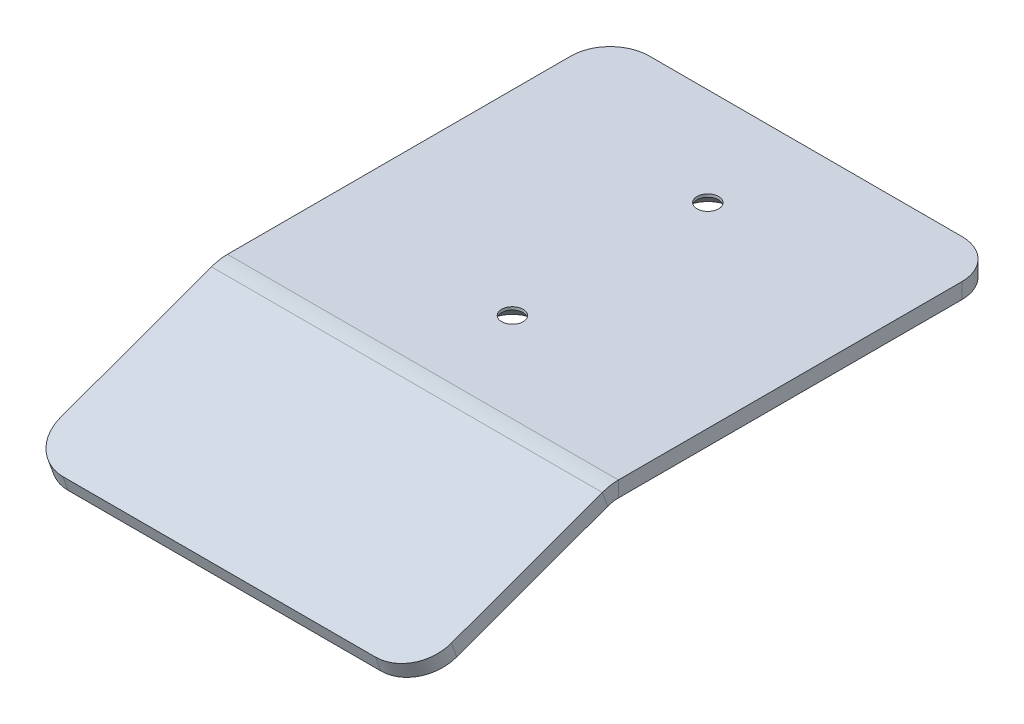
ISO-10303-21;
HEADER;
FILE_DESCRIPTION(('STEP AP214'),'2;1');
FILE_NAME('part.step','',(''),(''),'','','');
FILE_SCHEMA(('AUTOMOTIVE_DESIGN { 1 0 10303 214 1 1 1 1 }'));
ENDSEC;
DATA;
#1=APPLICATION_CONTEXT('core data for automotive mechanical design processes');
#2=APPLICATION_PROTOCOL_DEFINITION('international standard','automotive_design',2000,#1);
#3=PRODUCT_CONTEXT('',#1,'mechanical');
#4=PRODUCT('Part','Part','',(#3));
#5=PRODUCT_RELATED_PRODUCT_CATEGORY('part','',(#4));
#6=PRODUCT_DEFINITION_FORMATION('','',#4);
#7=PRODUCT_DEFINITION_CONTEXT('part definition',#1,'design');
#8=PRODUCT_DEFINITION('design','',#6,#7);
#9=PRODUCT_DEFINITION_SHAPE('','',#8);
#10=(LENGTH_UNIT() NAMED_UNIT(*) SI_UNIT(.MILLI.,.METRE.));
#11=(NAMED_UNIT(*) PLANE_ANGLE_UNIT() SI_UNIT($,.RADIAN.));
#12=(NAMED_UNIT(*) SI_UNIT($,.STERADIAN.) SOLID_ANGLE_UNIT());
#13=UNCERTAINTY_MEASURE_WITH_UNIT(LENGTH_MEASURE(1.E-05),#10,'distance_accuracy_value','');
#14=(GEOMETRIC_REPRESENTATION_CONTEXT(3) GLOBAL_UNCERTAINTY_ASSIGNED_CONTEXT((#13)) GLOBAL_UNIT_ASSIGNED_CONTEXT((#10,
#11,#12)) REPRESENTATION_CONTEXT('',''));
#15=CARTESIAN_POINT('',(0.,0.,0.));
#16=DIRECTION('',(0.,0.,1.));
#17=DIRECTION('',(1.,0.,0.));
#18=AXIS2_PLACEMENT_3D('',#15,#16,#17);
#19=CARTESIAN_POINT('',(50.,0.,47.8840762314985));
#20=DIRECTION('',(1.,0.,0.));
#21=DIRECTION('',(0.,0.,-1.));
#22=AXIS2_PLACEMENT_3D('',#19,#20,#21);
#23=PLANE('',#22);
#24=DIRECTION('',(0.,-1.,0.));
#25=VECTOR('',#24,1.);
#26=CARTESIAN_POINT('',(50.,0.,47.8840762314985));
#27=LINE('',#26,#25);
#28=CARTESIAN_POINT('',(50.,0.,47.8840762314985));
#29=VERTEX_POINT('',#28);
#30=CARTESIAN_POINT('',(50.,-4.,47.8840762314985));
#31=VERTEX_POINT('',#30);
#32=EDGE_CURVE('E129',#29,#31,#27,.T.);
#33=ORIENTED_EDGE('',*,*,#32,.F.);
#34=CARTESIAN_POINT('',(50.,-12.,47.8840762314985));
#35=DIRECTION('',(-1.,0.,0.));
#36=DIRECTION('',(0.,0.,1.));
#37=AXIS2_PLACEMENT_3D('',#34,#35,#36);
#38=CIRCLE('',#37,12.);
#39=CARTESIAN_POINT('',(50.,-0.723688550569075,51.9883179514064));
#40=VERTEX_POINT('',#39);
#41=EDGE_CURVE('E133',#40,#29,#38,.T.);
#42=ORIENTED_EDGE('',*,*,#41,.F.);
#43=DIRECTION('',(0.,0.93969262078591,0.342020143325664));
#44=VECTOR('',#43,1.);
#45=CARTESIAN_POINT('',(50.,-4.48245903371272,50.6202373781038));
#46=LINE('',#45,#44);
#47=CARTESIAN_POINT('',(50.,-4.48245903371272,50.6202373781038));
#48=VERTEX_POINT('',#47);
#49=EDGE_CURVE('E141',#48,#40,#46,.T.);
#50=ORIENTED_EDGE('',*,*,#49,.F.);
#51=CARTESIAN_POINT('',(50.,-12.,47.8840762314985));
#52=DIRECTION('',(1.,0.,0.));
#53=DIRECTION('',(0.,0.,-1.));
#54=AXIS2_PLACEMENT_3D('',#51,#52,#53);
#55=CIRCLE('',#54,8.);
#56=EDGE_CURVE('E135',#48,#31,#55,.F.);
#57=ORIENTED_EDGE('',*,*,#56,.T.);
#58=EDGE_LOOP('',(#33,#42,#50,#57));
#59=FACE_BOUND('',#58,.T.);
#60=ADVANCED_FACE('F39',(#59),#23,.T.);
#61=CARTESIAN_POINT('',(50.,-4.48245903371272,50.6202373781038));
#62=DIRECTION('',(1.,0.,0.));
#63=DIRECTION('',(0.,0.,-1.));
#64=AXIS2_PLACEMENT_3D('',#61,#62,#63);
#65=PLANE('',#64);
#66=DIRECTION('',(0.,0.,-1.));
#67=VECTOR('',#66,1.);
#68=CARTESIAN_POINT('',(50.,-4.,50.));
#69=LINE('',#68,#67);
#70=CARTESIAN_POINT('',(50.,-3.99999999999998,-40.));
#71=VERTEX_POINT('',#70);
#72=EDGE_CURVE('E163',#31,#71,#69,.T.);
#73=ORIENTED_EDGE('',*,*,#72,.T.);
#74=DIRECTION('',(0.,-1.,0.));
#75=VECTOR('',#74,1.);
#76=CARTESIAN_POINT('',(50.,-4.48245903371272,-40.));
#77=LINE('',#76,#75);
#78=CARTESIAN_POINT('',(50.,0.,-40.));
#79=VERTEX_POINT('',#78);
#80=EDGE_CURVE('E162',#71,#79,#77,.F.);
#81=ORIENTED_EDGE('',*,*,#80,.T.);
#82=DIRECTION('',(0.,0.,-1.));
#83=VECTOR('',#82,1.);
#84=CARTESIAN_POINT('',(50.,0.,50.));
#85=LINE('',#84,#83);
#86=EDGE_CURVE('E150',#29,#79,#85,.T.);
#87=ORIENTED_EDGE('',*,*,#86,.F.);
#88=ORIENTED_EDGE('',*,*,#32,.T.);
#89=EDGE_LOOP('',(#73,#81,#87,#88));
#90=FACE_BOUND('',#89,.T.);
#91=ADVANCED_FACE('F160',(#90),#65,.T.);
#92=CARTESIAN_POINT('',(-50.,-0.723688550569075,51.9883179514064));
#93=DIRECTION('',(-1.,0.,0.));
#94=DIRECTION('',(0.,0.,1.));
#95=AXIS2_PLACEMENT_3D('',#92,#93,#94);
#96=PLANE('',#95);
#97=DIRECTION('',(0.,-0.93969262078591,-0.342020143325664));
#98=VECTOR('',#97,1.);
#99=CARTESIAN_POINT('',(-50.,-0.723688550569075,51.9883179514064));
#100=LINE('',#99,#98);
#101=CARTESIAN_POINT('',(-50.,-0.723688550569075,51.9883179514064));
#102=VERTEX_POINT('',#101);
#103=CARTESIAN_POINT('',(-50.,-4.48245903371272,50.6202373781038));
#104=VERTEX_POINT('',#103);
#105=EDGE_CURVE('E207',#102,#104,#100,.T.);
#106=ORIENTED_EDGE('',*,*,#105,.F.);
#107=CARTESIAN_POINT('',(-50.,-12.,47.8840762314985));
#108=DIRECTION('',(-1.,0.,0.));
#109=DIRECTION('',(0.,0.,1.));
#110=AXIS2_PLACEMENT_3D('',#107,#108,#109);
#111=CIRCLE('',#110,12.);
#112=CARTESIAN_POINT('',(-50.,0.,47.8840762314985));
#113=VERTEX_POINT('',#112);
#114=EDGE_CURVE('E182',#102,#113,#111,.T.);
#115=ORIENTED_EDGE('',*,*,#114,.T.);
#116=DIRECTION('',(0.,1.,0.));
#117=VECTOR('',#116,1.);
#118=CARTESIAN_POINT('',(-50.,-4.,47.8840762314985));
#119=LINE('',#118,#117);
#120=CARTESIAN_POINT('',(-50.,-4.,47.8840762314985));
#121=VERTEX_POINT('',#120);
#122=EDGE_CURVE('E205',#121,#113,#119,.T.);
#123=ORIENTED_EDGE('',*,*,#122,.F.);
#124=CARTESIAN_POINT('',(-50.,-12.,47.8840762314985));
#125=DIRECTION('',(1.,0.,0.));
#126=DIRECTION('',(0.,0.,-1.));
#127=AXIS2_PLACEMENT_3D('',#124,#125,#126);
#128=CIRCLE('',#127,8.);
#129=EDGE_CURVE('E188',#104,#121,#128,.F.);
#130=ORIENTED_EDGE('',*,*,#129,.F.);
#131=EDGE_LOOP('',(#106,#115,#123,#130));
#132=FACE_BOUND('',#131,.T.);
#133=ADVANCED_FACE('F316',(#132),#96,.T.);
#134=CARTESIAN_POINT('',(-50.,-4.,47.8840762314985));
#135=DIRECTION('',(-1.,0.,0.));
#136=DIRECTION('',(0.,0.,1.));
#137=AXIS2_PLACEMENT_3D('',#134,#135,#136);
#138=PLANE('',#137);
#139=DIRECTION('',(0.,0.342020143325663,-0.93969262078591));
#140=VECTOR('',#139,1.);
#141=CARTESIAN_POINT('',(-50.,-3.75877048314364,48.6319194266973));
#142=LINE('',#141,#140);
#143=CARTESIAN_POINT('',(-50.,-18.5370807631968,89.2349932188382));
#144=VERTEX_POINT('',#143);
#145=EDGE_CURVE('E186',#144,#104,#142,.T.);
#146=ORIENTED_EDGE('',*,*,#145,.F.);
#147=DIRECTION('',(0.,0.939692620785911,0.342020143325662));
#148=VECTOR('',#147,1.);
#149=CARTESIAN_POINT('',(-50.,-18.9904439570081,89.0699825109791));
#150=LINE('',#149,#148);
#151=CARTESIAN_POINT('',(-50.,-14.7783102800531,90.6030737921409));
#152=VERTEX_POINT('',#151);
#153=EDGE_CURVE('E228',#144,#152,#150,.T.);
#154=ORIENTED_EDGE('',*,*,#153,.T.);
#155=DIRECTION('',(0.,0.342020143325663,-0.93969262078591));
#156=VECTOR('',#155,1.);
#157=CARTESIAN_POINT('',(-50.,0.,50.));
#158=LINE('',#157,#156);
#159=EDGE_CURVE('E184',#152,#102,#158,.T.);
#160=ORIENTED_EDGE('',*,*,#159,.T.);
#161=ORIENTED_EDGE('',*,*,#105,.T.);
#162=EDGE_LOOP('',(#146,#154,#160,#161));
#163=FACE_BOUND('',#162,.T.);
#164=ADVANCED_FACE('F248',(#163),#138,.T.);
#165=CARTESIAN_POINT('',(50.,-4.,50.));
#166=DIRECTION('',(0.,1.,0.));
#167=DIRECTION('',(0.,0.,1.));
#168=AXIS2_PLACEMENT_3D('',#165,#166,#167);
#169=PLANE('',#168);
#170=CARTESIAN_POINT('',(0.,-3.99999999999999,25.));
#171=DIRECTION('',(0.,-1.,0.));
#172=DIRECTION('',(0.,0.,-1.));
#173=AXIS2_PLACEMENT_3D('',#170,#171,#172);
#174=CIRCLE('',#173,6.);
#175=CARTESIAN_POINT('',(0.,-3.99999999999999,19.));
#176=VERTEX_POINT('',#175);
#177=EDGE_CURVE('E283',#176,#176,#174,.T.);
#178=ORIENTED_EDGE('',*,*,#177,.F.);
#179=EDGE_LOOP('',(#178));
#180=FACE_BOUND('',#179,.T.);
#181=CARTESIAN_POINT('',(0.,-3.99999999999999,-25.));
#182=DIRECTION('',(0.,-1.,0.));
#183=DIRECTION('',(0.,0.,-1.));
#184=AXIS2_PLACEMENT_3D('',#181,#182,#183);
#185=CIRCLE('',#184,6.);
#186=CARTESIAN_POINT('',(0.,-3.99999999999999,-31.));
#187=VERTEX_POINT('',#186);
#188=EDGE_CURVE('E274',#187,#187,#185,.T.);
#189=ORIENTED_EDGE('',*,*,#188,.F.);
#190=EDGE_LOOP('',(#189));
#191=FACE_BOUND('',#190,.T.);
#192=DIRECTION('',(0.,0.,-1.));
#193=VECTOR('',#192,1.);
#194=CARTESIAN_POINT('',(-50.,-4.,50.));
#195=LINE('',#194,#193);
#196=CARTESIAN_POINT('',(-50.,-3.99999999999998,-40.));
#197=VERTEX_POINT('',#196);
#198=EDGE_CURVE('E177',#121,#197,#195,.T.);
#199=ORIENTED_EDGE('',*,*,#198,.T.);
#200=CARTESIAN_POINT('',(-40.,-3.99999999999998,-40.));
#201=DIRECTION('',(0.,1.,0.));
#202=DIRECTION('',(0.,0.,1.));
#203=AXIS2_PLACEMENT_3D('',#200,#201,#202);
#204=CIRCLE('',#203,10.);
#205=CARTESIAN_POINT('',(-40.,-3.99999999999998,-50.));
#206=VERTEX_POINT('',#205);
#207=EDGE_CURVE('E216',#197,#206,#204,.F.);
#208=ORIENTED_EDGE('',*,*,#207,.T.);
#209=DIRECTION('',(-1.,0.,0.));
#210=VECTOR('',#209,1.);
#211=CARTESIAN_POINT('',(50.,-3.99999999999998,-50.));
#212=LINE('',#211,#210);
#213=CARTESIAN_POINT('',(40.,-3.99999999999998,-50.));
#214=VERTEX_POINT('',#213);
#215=EDGE_CURVE('E202',#214,#206,#212,.T.);
#216=ORIENTED_EDGE('',*,*,#215,.F.);
#217=CARTESIAN_POINT('',(40.,-3.99999999999998,-40.));
#218=DIRECTION('',(0.,1.,0.));
#219=DIRECTION('',(0.,0.,1.));
#220=AXIS2_PLACEMENT_3D('',#217,#218,#219);
#221=CIRCLE('',#220,10.);
#222=EDGE_CURVE('E214',#214,#71,#221,.F.);
#223=ORIENTED_EDGE('',*,*,#222,.T.);
#224=ORIENTED_EDGE('',*,*,#72,.F.);
#225=DIRECTION('',(-1.,0.,0.));
#226=VECTOR('',#225,1.);
#227=CARTESIAN_POINT('',(50.,-4.,47.8840762314985));
#228=LINE('',#227,#226);
#229=EDGE_CURVE('E176',#31,#121,#228,.T.);
#230=ORIENTED_EDGE('',*,*,#229,.T.);
#231=EDGE_LOOP('',(#199,#208,#216,#223,#224,#230));
#232=FACE_BOUND('',#231,.T.);
#233=ADVANCED_FACE('F266',(#180,#191,#232),#169,.F.);
#234=CARTESIAN_POINT('',(50.,0.,-50.));
#235=DIRECTION('',(0.,0.,-1.));
#236=DIRECTION('',(-1.,0.,0.));
#237=AXIS2_PLACEMENT_3D('',#234,#235,#236);
#238=PLANE('',#237);
#239=ORIENTED_EDGE('',*,*,#215,.T.);
#240=DIRECTION('',(0.,-1.,0.));
#241=VECTOR('',#240,1.);
#242=CARTESIAN_POINT('',(-40.,0.,-50.));
#243=LINE('',#242,#241);
#244=CARTESIAN_POINT('',(-40.,0.,-50.));
#245=VERTEX_POINT('',#244);
#246=EDGE_CURVE('E221',#206,#245,#243,.F.);
#247=ORIENTED_EDGE('',*,*,#246,.T.);
#248=DIRECTION('',(-1.,0.,0.));
#249=VECTOR('',#248,1.);
#250=CARTESIAN_POINT('',(50.,0.,-50.));
#251=LINE('',#250,#249);
#252=CARTESIAN_POINT('',(40.,0.,-50.));
#253=VERTEX_POINT('',#252);
#254=EDGE_CURVE('E157',#253,#245,#251,.T.);
#255=ORIENTED_EDGE('',*,*,#254,.F.);
#256=DIRECTION('',(0.,-1.,0.));
#257=VECTOR('',#256,1.);
#258=CARTESIAN_POINT('',(40.,0.,-50.));
#259=LINE('',#258,#257);
#260=EDGE_CURVE('E218',#253,#214,#259,.T.);
#261=ORIENTED_EDGE('',*,*,#260,.T.);
#262=EDGE_LOOP('',(#239,#247,#255,#261));
#263=FACE_BOUND('',#262,.T.);
#264=ADVANCED_FACE('F291',(#263),#238,.T.);
#265=CARTESIAN_POINT('',(50.,0.,50.));
#266=DIRECTION('',(0.,1.,0.));
#267=DIRECTION('',(0.,0.,1.));
#268=AXIS2_PLACEMENT_3D('',#265,#266,#267);
#269=PLANE('',#268);
#270=CARTESIAN_POINT('',(0.,0.,25.));
#271=DIRECTION('',(0.,-1.,0.));
#272=DIRECTION('',(0.,0.,-1.));
#273=AXIS2_PLACEMENT_3D('',#270,#271,#272);
#274=CIRCLE('',#273,2.75);
#275=CARTESIAN_POINT('',(0.,0.,22.25));
#276=VERTEX_POINT('',#275);
#277=EDGE_CURVE('E277',#276,#276,#274,.T.);
#278=ORIENTED_EDGE('',*,*,#277,.T.);
#279=EDGE_LOOP('',(#278));
#280=FACE_BOUND('',#279,.T.);
#281=CARTESIAN_POINT('',(0.,0.,-25.));
#282=DIRECTION('',(0.,-1.,0.));
#283=DIRECTION('',(0.,0.,-1.));
#284=AXIS2_PLACEMENT_3D('',#281,#282,#283);
#285=CIRCLE('',#284,2.75);
#286=CARTESIAN_POINT('',(0.,0.,-27.75));
#287=VERTEX_POINT('',#286);
#288=EDGE_CURVE('E180',#287,#287,#285,.T.);
#289=ORIENTED_EDGE('',*,*,#288,.T.);
#290=EDGE_LOOP('',(#289));
#291=FACE_BOUND('',#290,.T.);
#292=ORIENTED_EDGE('',*,*,#254,.T.);
#293=CARTESIAN_POINT('',(-40.,0.,-40.));
#294=DIRECTION('',(0.,1.,0.));
#295=DIRECTION('',(0.,0.,1.));
#296=AXIS2_PLACEMENT_3D('',#293,#294,#295);
#297=CIRCLE('',#296,10.);
#298=CARTESIAN_POINT('',(-50.,0.,-40.));
#299=VERTEX_POINT('',#298);
#300=EDGE_CURVE('E225',#245,#299,#297,.T.);
#301=ORIENTED_EDGE('',*,*,#300,.T.);
#302=DIRECTION('',(0.,0.,-1.));
#303=VECTOR('',#302,1.);
#304=CARTESIAN_POINT('',(-50.,0.,50.));
#305=LINE('',#304,#303);
#306=EDGE_CURVE('E153',#113,#299,#305,.T.);
#307=ORIENTED_EDGE('',*,*,#306,.F.);
#308=DIRECTION('',(-1.,0.,0.));
#309=VECTOR('',#308,1.);
#310=CARTESIAN_POINT('',(50.,0.,47.8840762314985));
#311=LINE('',#310,#309);
#312=EDGE_CURVE('E147',#29,#113,#311,.T.);
#313=ORIENTED_EDGE('',*,*,#312,.F.);
#314=ORIENTED_EDGE('',*,*,#86,.T.);
#315=CARTESIAN_POINT('',(40.,0.,-40.));
#316=DIRECTION('',(0.,1.,0.));
#317=DIRECTION('',(0.,0.,1.));
#318=AXIS2_PLACEMENT_3D('',#315,#316,#317);
#319=CIRCLE('',#318,10.);
#320=EDGE_CURVE('E223',#79,#253,#319,.T.);
#321=ORIENTED_EDGE('',*,*,#320,.T.);
#322=EDGE_LOOP('',(#292,#301,#307,#313,#314,#321));
#323=FACE_BOUND('',#322,.T.);
#324=ADVANCED_FACE('F149',(#280,#291,#323),#269,.T.);
#325=CARTESIAN_POINT('',(50.,-12.,47.8840762314985));
#326=DIRECTION('',(-1.,0.,0.));
#327=DIRECTION('',(0.,0.,1.));
#328=AXIS2_PLACEMENT_3D('',#325,#326,#327);
#329=CYLINDRICAL_SURFACE('',#328,12.);
#330=ORIENTED_EDGE('',*,*,#114,.F.);
#331=DIRECTION('',(-1.,0.,0.));
#332=VECTOR('',#331,1.);
#333=CARTESIAN_POINT('',(50.,-0.723688550569075,51.9883179514064));
#334=LINE('',#333,#332);
#335=EDGE_CURVE('E158',#40,#102,#334,.T.);
#336=ORIENTED_EDGE('',*,*,#335,.F.);
#337=ORIENTED_EDGE('',*,*,#41,.T.);
#338=ORIENTED_EDGE('',*,*,#312,.T.);
#339=EDGE_LOOP('',(#330,#336,#337,#338));
#340=FACE_BOUND('',#339,.T.);
#341=ADVANCED_FACE('F166',(#340),#329,.T.);
#342=CARTESIAN_POINT('',(50.,0.,50.));
#343=DIRECTION('',(0.,0.93969262078591,0.342020143325663));
#344=DIRECTION('',(0.,-0.342020143325663,0.93969262078591));
#345=AXIS2_PLACEMENT_3D('',#342,#343,#344);
#346=PLANE('',#345);
#347=ORIENTED_EDGE('',*,*,#159,.F.);
#348=CARTESIAN_POINT('',(-40.,-14.7783102800531,90.6030737921409));
#349=DIRECTION('',(0.,0.93969262078591,0.342020143325663));
#350=DIRECTION('',(0.,-0.342020143325663,0.93969262078591));
#351=AXIS2_PLACEMENT_3D('',#348,#349,#350);
#352=CIRCLE('',#351,10.);
#353=CARTESIAN_POINT('',(-40.,-18.1985117133098,100.));
#354=VERTEX_POINT('',#353);
#355=EDGE_CURVE('E233',#152,#354,#352,.T.);
#356=ORIENTED_EDGE('',*,*,#355,.T.);
#357=DIRECTION('',(-1.,0.,0.));
#358=VECTOR('',#357,1.);
#359=CARTESIAN_POINT('',(50.,-18.1985117133098,100.));
#360=LINE('',#359,#358);
#361=CARTESIAN_POINT('',(40.,-18.1985117133098,100.));
#362=VERTEX_POINT('',#361);
#363=EDGE_CURVE('E198',#362,#354,#360,.T.);
#364=ORIENTED_EDGE('',*,*,#363,.F.);
#365=CARTESIAN_POINT('',(40.,-14.7783102800531,90.6030737921409));
#366=DIRECTION('',(0.,0.93969262078591,0.342020143325663));
#367=DIRECTION('',(0.,-0.342020143325663,0.93969262078591));
#368=AXIS2_PLACEMENT_3D('',#365,#366,#367);
#369=CIRCLE('',#368,10.);
#370=CARTESIAN_POINT('',(50.,-14.7783102800531,90.6030737921409));
#371=VERTEX_POINT('',#370);
#372=EDGE_CURVE('E231',#362,#371,#369,.T.);
#373=ORIENTED_EDGE('',*,*,#372,.T.);
#374=DIRECTION('',(0.,0.342020143325663,-0.93969262078591));
#375=VECTOR('',#374,1.);
#376=CARTESIAN_POINT('',(50.,0.,50.));
#377=LINE('',#376,#375);
#378=EDGE_CURVE('E168',#371,#40,#377,.T.);
#379=ORIENTED_EDGE('',*,*,#378,.T.);
#380=ORIENTED_EDGE('',*,*,#335,.T.);
#381=EDGE_LOOP('',(#347,#356,#364,#373,#379,#380));
#382=FACE_BOUND('',#381,.T.);
#383=ADVANCED_FACE('F254',(#382),#346,.T.);
#384=CARTESIAN_POINT('',(50.,-21.9572821964534,98.6319194266973));
#385=DIRECTION('',(0.,-0.342020143325662,0.939692620785911));
#386=DIRECTION('',(0.,-0.939692620785911,-0.342020143325662));
#387=AXIS2_PLACEMENT_3D('',#384,#385,#386);
#388=PLANE('',#387);
#389=ORIENTED_EDGE('',*,*,#363,.T.);
#390=DIRECTION('',(0.,0.939692620785911,0.342020143325662));
#391=VECTOR('',#390,1.);
#392=CARTESIAN_POINT('',(-40.,-21.9572821964534,98.6319194266973));
#393=LINE('',#392,#391);
#394=CARTESIAN_POINT('',(-40.,-21.9572821964534,98.6319194266973));
#395=VERTEX_POINT('',#394);
#396=EDGE_CURVE('E60',#354,#395,#393,.F.);
#397=ORIENTED_EDGE('',*,*,#396,.T.);
#398=DIRECTION('',(-1.,0.,0.));
#399=VECTOR('',#398,1.);
#400=CARTESIAN_POINT('',(50.,-21.9572821964534,98.6319194266973));
#401=LINE('',#400,#399);
#402=CARTESIAN_POINT('',(40.,-21.9572821964534,98.6319194266973));
#403=VERTEX_POINT('',#402);
#404=EDGE_CURVE('E196',#403,#395,#401,.T.);
#405=ORIENTED_EDGE('',*,*,#404,.F.);
#406=DIRECTION('',(0.,0.939692620785911,0.342020143325662));
#407=VECTOR('',#406,1.);
#408=CARTESIAN_POINT('',(40.,-18.1985117133098,100.));
#409=LINE('',#408,#407);
#410=EDGE_CURVE('E235',#403,#362,#409,.T.);
#411=ORIENTED_EDGE('',*,*,#410,.T.);
#412=EDGE_LOOP('',(#389,#397,#405,#411));
#413=FACE_BOUND('',#412,.T.);
#414=ADVANCED_FACE('F255',(#413),#388,.T.);
#415=CARTESIAN_POINT('',(50.,-3.75877048314364,48.6319194266973));
#416=DIRECTION('',(0.,0.93969262078591,0.342020143325663));
#417=DIRECTION('',(0.,-0.342020143325663,0.93969262078591));
#418=AXIS2_PLACEMENT_3D('',#415,#416,#417);
#419=PLANE('',#418);
#420=ORIENTED_EDGE('',*,*,#404,.T.);
#421=CARTESIAN_POINT('',(-40.,-18.5370807631968,89.2349932188383));
#422=DIRECTION('',(0.,0.93969262078591,0.342020143325663));
#423=DIRECTION('',(0.,-0.342020143325663,0.93969262078591));
#424=AXIS2_PLACEMENT_3D('',#421,#422,#423);
#425=CIRCLE('',#424,10.);
#426=EDGE_CURVE('E47',#395,#144,#425,.F.);
#427=ORIENTED_EDGE('',*,*,#426,.T.);
#428=ORIENTED_EDGE('',*,*,#145,.T.);
#429=DIRECTION('',(-1.,0.,0.));
#430=VECTOR('',#429,1.);
#431=CARTESIAN_POINT('',(50.,-4.48245903371272,50.6202373781038));
#432=LINE('',#431,#430);
#433=EDGE_CURVE('E193',#48,#104,#432,.T.);
#434=ORIENTED_EDGE('',*,*,#433,.F.);
#435=DIRECTION('',(0.,0.342020143325663,-0.93969262078591));
#436=VECTOR('',#435,1.);
#437=CARTESIAN_POINT('',(50.,-3.75877048314364,48.6319194266973));
#438=LINE('',#437,#436);
#439=CARTESIAN_POINT('',(50.,-18.5370807631968,89.2349932188382));
#440=VERTEX_POINT('',#439);
#441=EDGE_CURVE('E170',#440,#48,#438,.T.);
#442=ORIENTED_EDGE('',*,*,#441,.F.);
#443=CARTESIAN_POINT('',(40.,-18.5370807631968,89.2349932188382));
#444=DIRECTION('',(0.,0.93969262078591,0.342020143325663));
#445=DIRECTION('',(0.,-0.342020143325663,0.93969262078591));
#446=AXIS2_PLACEMENT_3D('',#443,#444,#445);
#447=CIRCLE('',#446,10.);
#448=EDGE_CURVE('E239',#440,#403,#447,.F.);
#449=ORIENTED_EDGE('',*,*,#448,.T.);
#450=EDGE_LOOP('',(#420,#427,#428,#434,#442,#449));
#451=FACE_BOUND('',#450,.T.);
#452=ADVANCED_FACE('F243',(#451),#419,.F.);
#453=CARTESIAN_POINT('',(50.,-12.,47.8840762314985));
#454=DIRECTION('',(-1.,0.,0.));
#455=DIRECTION('',(0.,0.,1.));
#456=AXIS2_PLACEMENT_3D('',#453,#454,#455);
#457=CYLINDRICAL_SURFACE('',#456,8.);
#458=ORIENTED_EDGE('',*,*,#129,.T.);
#459=ORIENTED_EDGE('',*,*,#229,.F.);
#460=ORIENTED_EDGE('',*,*,#56,.F.);
#461=ORIENTED_EDGE('',*,*,#433,.T.);
#462=EDGE_LOOP('',(#458,#459,#460,#461));
#463=FACE_BOUND('',#462,.T.);
#464=ADVANCED_FACE('F262',(#463),#457,.F.);
#465=CARTESIAN_POINT('',(50.,-12.,47.8840762314985));
#466=DIRECTION('',(-1.,0.,0.));
#467=DIRECTION('',(0.,0.,1.));
#468=AXIS2_PLACEMENT_3D('',#465,#466,#467);
#469=PLANE('',#468);
#470=ORIENTED_EDGE('',*,*,#378,.F.);
#471=DIRECTION('',(0.,0.939692620785911,0.342020143325662));
#472=VECTOR('',#471,1.);
#473=CARTESIAN_POINT('',(50.,-18.5370807631968,89.2349932188382));
#474=LINE('',#473,#472);
#475=EDGE_CURVE('E11',#371,#440,#474,.F.);
#476=ORIENTED_EDGE('',*,*,#475,.T.);
#477=ORIENTED_EDGE('',*,*,#441,.T.);
#478=ORIENTED_EDGE('',*,*,#49,.T.);
#479=EDGE_LOOP('',(#470,#476,#477,#478));
#480=FACE_BOUND('',#479,.T.);
#481=ADVANCED_FACE('F259',(#480),#469,.F.);
#482=CARTESIAN_POINT('',(-50.,-12.,47.8840762314985));
#483=DIRECTION('',(-1.,0.,0.));
#484=DIRECTION('',(0.,0.,1.));
#485=AXIS2_PLACEMENT_3D('',#482,#483,#484);
#486=PLANE('',#485);
#487=ORIENTED_EDGE('',*,*,#306,.T.);
#488=DIRECTION('',(0.,-1.,0.));
#489=VECTOR('',#488,1.);
#490=CARTESIAN_POINT('',(-50.,-12.,-40.));
#491=LINE('',#490,#489);
#492=EDGE_CURVE('E140',#299,#197,#491,.T.);
#493=ORIENTED_EDGE('',*,*,#492,.T.);
#494=ORIENTED_EDGE('',*,*,#198,.F.);
#495=ORIENTED_EDGE('',*,*,#122,.T.);
#496=EDGE_LOOP('',(#487,#493,#494,#495));
#497=FACE_BOUND('',#496,.T.);
#498=ADVANCED_FACE('F307',(#497),#486,.T.);
#499=CARTESIAN_POINT('',(0.,-3.99999999999999,-25.));
#500=DIRECTION('',(0.,-1.,0.));
#501=DIRECTION('',(0.,0.,-1.));
#502=AXIS2_PLACEMENT_3D('',#499,#500,#501);
#503=CYLINDRICAL_SURFACE('',#502,2.75);
#504=ORIENTED_EDGE('',*,*,#288,.F.);
#505=EDGE_LOOP('',(#504));
#506=FACE_BOUND('',#505,.T.);
#507=CARTESIAN_POINT('',(0.,-0.749999999999992,-25.));
#508=DIRECTION('',(0.,-1.,0.));
#509=DIRECTION('',(0.,0.,-1.));
#510=AXIS2_PLACEMENT_3D('',#507,#508,#509);
#511=CIRCLE('',#510,2.75);
#512=CARTESIAN_POINT('',(0.,-0.749999999999992,-27.75));
#513=VERTEX_POINT('',#512);
#514=EDGE_CURVE('E271',#513,#513,#511,.T.);
#515=ORIENTED_EDGE('',*,*,#514,.T.);
#516=EDGE_LOOP('',(#515));
#517=FACE_BOUND('',#516,.T.);
#518=ADVANCED_FACE('F298',(#506,#517),#503,.F.);
#519=CARTESIAN_POINT('',(0.,-3.99999999999999,-25.));
#520=DIRECTION('',(0.,-1.,0.));
#521=DIRECTION('',(0.,0.,-1.));
#522=AXIS2_PLACEMENT_3D('',#519,#520,#521);
#523=CONICAL_SURFACE('',#522,6.,0.785398163397449);
#524=ORIENTED_EDGE('',*,*,#514,.F.);
#525=EDGE_LOOP('',(#524));
#526=FACE_BOUND('',#525,.T.);
#527=ORIENTED_EDGE('',*,*,#188,.T.);
#528=EDGE_LOOP('',(#527));
#529=FACE_BOUND('',#528,.T.);
#530=ADVANCED_FACE('F295',(#526,#529),#523,.F.);
#531=CARTESIAN_POINT('',(0.,-3.99999999999999,25.));
#532=DIRECTION('',(0.,-1.,0.));
#533=DIRECTION('',(0.,0.,-1.));
#534=AXIS2_PLACEMENT_3D('',#531,#532,#533);
#535=CYLINDRICAL_SURFACE('',#534,2.75);
#536=ORIENTED_EDGE('',*,*,#277,.F.);
#537=EDGE_LOOP('',(#536));
#538=FACE_BOUND('',#537,.T.);
#539=CARTESIAN_POINT('',(0.,-0.749999999999992,25.));
#540=DIRECTION('',(0.,-1.,0.));
#541=DIRECTION('',(0.,0.,-1.));
#542=AXIS2_PLACEMENT_3D('',#539,#540,#541);
#543=CIRCLE('',#542,2.75);
#544=CARTESIAN_POINT('',(0.,-0.749999999999992,22.25));
#545=VERTEX_POINT('',#544);
#546=EDGE_CURVE('E280',#545,#545,#543,.T.);
#547=ORIENTED_EDGE('',*,*,#546,.T.);
#548=EDGE_LOOP('',(#547));
#549=FACE_BOUND('',#548,.T.);
#550=ADVANCED_FACE('F297',(#538,#549),#535,.F.);
#551=CARTESIAN_POINT('',(0.,-3.99999999999999,25.));
#552=DIRECTION('',(0.,-1.,0.));
#553=DIRECTION('',(0.,0.,-1.));
#554=AXIS2_PLACEMENT_3D('',#551,#552,#553);
#555=CONICAL_SURFACE('',#554,6.,0.785398163397449);
#556=ORIENTED_EDGE('',*,*,#546,.F.);
#557=EDGE_LOOP('',(#556));
#558=FACE_BOUND('',#557,.T.);
#559=ORIENTED_EDGE('',*,*,#177,.T.);
#560=EDGE_LOOP('',(#559));
#561=FACE_BOUND('',#560,.T.);
#562=ADVANCED_FACE('F287',(#558,#561),#555,.F.);
#563=CARTESIAN_POINT('',(-40.,-12.,-40.));
#564=DIRECTION('',(0.,-1.,0.));
#565=DIRECTION('',(0.,0.,-1.));
#566=AXIS2_PLACEMENT_3D('',#563,#564,#565);
#567=CYLINDRICAL_SURFACE('',#566,10.);
#568=ORIENTED_EDGE('',*,*,#300,.F.);
#569=ORIENTED_EDGE('',*,*,#246,.F.);
#570=ORIENTED_EDGE('',*,*,#207,.F.);
#571=ORIENTED_EDGE('',*,*,#492,.F.);
#572=EDGE_LOOP('',(#568,#569,#570,#571));
#573=FACE_BOUND('',#572,.T.);
#574=ADVANCED_FACE('F320',(#573),#567,.T.);
#575=CARTESIAN_POINT('',(40.,0.,-40.));
#576=DIRECTION('',(0.,-1.,0.));
#577=DIRECTION('',(0.,0.,-1.));
#578=AXIS2_PLACEMENT_3D('',#575,#576,#577);
#579=CYLINDRICAL_SURFACE('',#578,10.);
#580=ORIENTED_EDGE('',*,*,#320,.F.);
#581=ORIENTED_EDGE('',*,*,#80,.F.);
#582=ORIENTED_EDGE('',*,*,#222,.F.);
#583=ORIENTED_EDGE('',*,*,#260,.F.);
#584=EDGE_LOOP('',(#580,#581,#582,#583));
#585=FACE_BOUND('',#584,.T.);
#586=ADVANCED_FACE('F323',(#585),#579,.T.);
#587=CARTESIAN_POINT('',(-40.,-18.9904439570081,89.0699825109791));
#588=DIRECTION('',(0.,0.939692620785911,0.342020143325662));
#589=DIRECTION('',(0.,-0.342020143325662,0.939692620785911));
#590=AXIS2_PLACEMENT_3D('',#587,#588,#589);
#591=CYLINDRICAL_SURFACE('',#590,10.);
#592=ORIENTED_EDGE('',*,*,#426,.F.);
#593=ORIENTED_EDGE('',*,*,#396,.F.);
#594=ORIENTED_EDGE('',*,*,#355,.F.);
#595=ORIENTED_EDGE('',*,*,#153,.F.);
#596=EDGE_LOOP('',(#592,#593,#594,#595));
#597=FACE_BOUND('',#596,.T.);
#598=ADVANCED_FACE('F251',(#597),#591,.T.);
#599=CARTESIAN_POINT('',(40.,-18.5370807631968,89.2349932188382));
#600=DIRECTION('',(0.,-0.939692620785911,-0.342020143325662));
#601=DIRECTION('',(0.,0.342020143325662,-0.939692620785911));
#602=AXIS2_PLACEMENT_3D('',#599,#600,#601);
#603=CYLINDRICAL_SURFACE('',#602,10.);
#604=ORIENTED_EDGE('',*,*,#448,.F.);
#605=ORIENTED_EDGE('',*,*,#475,.F.);
#606=ORIENTED_EDGE('',*,*,#372,.F.);
#607=ORIENTED_EDGE('',*,*,#410,.F.);
#608=EDGE_LOOP('',(#604,#605,#606,#607));
#609=FACE_BOUND('',#608,.T.);
#610=ADVANCED_FACE('F41',(#609),#603,.T.);
#611=CLOSED_SHELL('',(#60,#91,#133,#164,#233,#264,#324,#341,#383,#414,#452,#464,#481,#498,#518,
#530,#550,#562,#574,#586,#598,#610));
#612=MANIFOLD_SOLID_BREP('B2',#611);
#613=ADVANCED_BREP_SHAPE_REPRESENTATION('',(#18,#612),#14);
#614=SHAPE_DEFINITION_REPRESENTATION(#9,#613);
ENDSEC;
END-ISO-10303-21;
